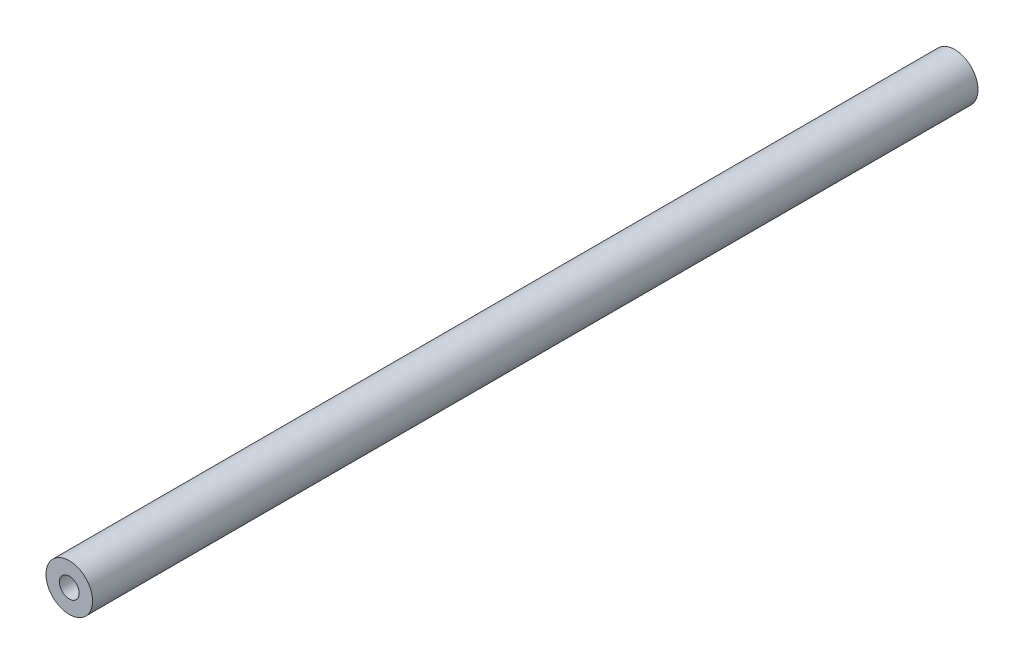
ISO-10303-21;
HEADER;
FILE_DESCRIPTION(('STEP AP214'),'2;1');
FILE_NAME('part.step','',(''),(''),'','','');
FILE_SCHEMA(('AUTOMOTIVE_DESIGN { 1 0 10303 214 1 1 1 1 }'));
ENDSEC;
DATA;
#1=APPLICATION_CONTEXT('core data for automotive mechanical design processes');
#2=APPLICATION_PROTOCOL_DEFINITION('international standard','automotive_design',2000,#1);
#3=PRODUCT_CONTEXT('',#1,'mechanical');
#4=PRODUCT('Part','Part','',(#3));
#5=PRODUCT_RELATED_PRODUCT_CATEGORY('part','',(#4));
#6=PRODUCT_DEFINITION_FORMATION('','',#4);
#7=PRODUCT_DEFINITION_CONTEXT('part definition',#1,'design');
#8=PRODUCT_DEFINITION('design','',#6,#7);
#9=PRODUCT_DEFINITION_SHAPE('','',#8);
#10=(LENGTH_UNIT() NAMED_UNIT(*) SI_UNIT(.MILLI.,.METRE.));
#11=(NAMED_UNIT(*) PLANE_ANGLE_UNIT() SI_UNIT($,.RADIAN.));
#12=(NAMED_UNIT(*) SI_UNIT($,.STERADIAN.) SOLID_ANGLE_UNIT());
#13=UNCERTAINTY_MEASURE_WITH_UNIT(LENGTH_MEASURE(1.E-05),#10,'distance_accuracy_value','');
#14=(GEOMETRIC_REPRESENTATION_CONTEXT(3) GLOBAL_UNCERTAINTY_ASSIGNED_CONTEXT((#13)) GLOBAL_UNIT_ASSIGNED_CONTEXT((#10,
#11,#12)) REPRESENTATION_CONTEXT('',''));
#15=CARTESIAN_POINT('',(0.,0.,0.));
#16=DIRECTION('',(0.,0.,1.));
#17=DIRECTION('',(1.,0.,0.));
#18=AXIS2_PLACEMENT_3D('',#15,#16,#17);
#19=CARTESIAN_POINT('',(0.,0.,90.4875));
#20=DIRECTION('',(0.,0.,-1.));
#21=DIRECTION('',(-1.,0.,0.));
#22=AXIS2_PLACEMENT_3D('',#19,#20,#21);
#23=CYLINDRICAL_SURFACE('',#22,4.7625);
#24=CARTESIAN_POINT('',(0.,0.,90.4875));
#25=DIRECTION('',(0.,0.,1.));
#26=DIRECTION('',(1.,0.,0.));
#27=AXIS2_PLACEMENT_3D('',#24,#25,#26);
#28=CIRCLE('',#27,4.7625);
#29=CARTESIAN_POINT('',(4.7625,0.,90.4875));
#30=VERTEX_POINT('',#29);
#31=EDGE_CURVE('E11',#30,#30,#28,.T.);
#32=ORIENTED_EDGE('',*,*,#31,.F.);
#33=EDGE_LOOP('',(#32));
#34=FACE_BOUND('',#33,.T.);
#35=CARTESIAN_POINT('',(0.,0.,-90.4875));
#36=DIRECTION('',(0.,0.,1.));
#37=DIRECTION('',(1.,0.,0.));
#38=AXIS2_PLACEMENT_3D('',#35,#36,#37);
#39=CIRCLE('',#38,4.7625);
#40=CARTESIAN_POINT('',(4.7625,0.,-90.4875));
#41=VERTEX_POINT('',#40);
#42=EDGE_CURVE('E44',#41,#41,#39,.T.);
#43=ORIENTED_EDGE('',*,*,#42,.T.);
#44=EDGE_LOOP('',(#43));
#45=FACE_BOUND('',#44,.T.);
#46=ADVANCED_FACE('F41',(#34,#45),#23,.T.);
#47=CARTESIAN_POINT('',(0.,0.,90.4875));
#48=DIRECTION('',(0.,0.,1.));
#49=DIRECTION('',(1.,0.,0.));
#50=AXIS2_PLACEMENT_3D('',#47,#48,#49);
#51=PLANE('',#50);
#52=CARTESIAN_POINT('',(0.,0.,90.4875));
#53=DIRECTION('',(0.,0.,1.));
#54=DIRECTION('',(1.,0.,0.));
#55=AXIS2_PLACEMENT_3D('',#52,#53,#54);
#56=CIRCLE('',#55,2.01929999999999);
#57=CARTESIAN_POINT('',(2.01929999999999,0.,90.4875));
#58=VERTEX_POINT('',#57);
#59=EDGE_CURVE('E65',#58,#58,#56,.T.);
#60=ORIENTED_EDGE('',*,*,#59,.F.);
#61=EDGE_LOOP('',(#60));
#62=FACE_BOUND('',#61,.T.);
#63=ORIENTED_EDGE('',*,*,#31,.T.);
#64=EDGE_LOOP('',(#63));
#65=FACE_BOUND('',#64,.T.);
#66=ADVANCED_FACE('F83',(#62,#65),#51,.T.);
#67=CARTESIAN_POINT('',(0.,0.,-90.4875));
#68=DIRECTION('',(0.,0.,1.));
#69=DIRECTION('',(1.,0.,0.));
#70=AXIS2_PLACEMENT_3D('',#67,#68,#69);
#71=PLANE('',#70);
#72=CARTESIAN_POINT('',(0.,0.,-90.4875));
#73=DIRECTION('',(0.,0.,-1.));
#74=DIRECTION('',(-1.,0.,0.));
#75=AXIS2_PLACEMENT_3D('',#72,#73,#74);
#76=CIRCLE('',#75,2.01929999999999);
#77=CARTESIAN_POINT('',(-2.01929999999999,0.,-90.4875));
#78=VERTEX_POINT('',#77);
#79=EDGE_CURVE('E64',#78,#78,#76,.T.);
#80=ORIENTED_EDGE('',*,*,#79,.F.);
#81=EDGE_LOOP('',(#80));
#82=FACE_BOUND('',#81,.T.);
#83=ORIENTED_EDGE('',*,*,#42,.F.);
#84=EDGE_LOOP('',(#83));
#85=FACE_BOUND('',#84,.T.);
#86=ADVANCED_FACE('F80',(#82,#85),#71,.F.);
#87=CARTESIAN_POINT('',(0.,0.,-78.5495));
#88=DIRECTION('',(0.,0.,-1.));
#89=DIRECTION('',(-1.,0.,0.));
#90=AXIS2_PLACEMENT_3D('',#87,#88,#89);
#91=CONICAL_SURFACE('',#90,2.01929999999999,1.02974425867665);
#92=CARTESIAN_POINT('',(0.,0.,-77.3361821519976));
#93=VERTEX_POINT('',#92);
#94=VERTEX_LOOP('',#93);
#95=FACE_BOUND('',#94,.T.);
#96=CARTESIAN_POINT('',(0.,0.,-78.5495));
#97=DIRECTION('',(0.,0.,-1.));
#98=DIRECTION('',(-1.,0.,0.));
#99=AXIS2_PLACEMENT_3D('',#96,#97,#98);
#100=CIRCLE('',#99,2.01929999999999);
#101=CARTESIAN_POINT('',(-2.01929999999999,0.,-78.5495));
#102=VERTEX_POINT('',#101);
#103=EDGE_CURVE('E68',#102,#102,#100,.T.);
#104=ORIENTED_EDGE('',*,*,#103,.T.);
#105=EDGE_LOOP('',(#104));
#106=FACE_BOUND('',#105,.T.);
#107=ADVANCED_FACE('F82',(#95,#106),#91,.F.);
#108=CARTESIAN_POINT('',(0.,0.,-90.4875));
#109=DIRECTION('',(0.,0.,-1.));
#110=DIRECTION('',(-1.,0.,0.));
#111=AXIS2_PLACEMENT_3D('',#108,#109,#110);
#112=CYLINDRICAL_SURFACE('',#111,2.01929999999999);
#113=ORIENTED_EDGE('',*,*,#103,.F.);
#114=EDGE_LOOP('',(#113));
#115=FACE_BOUND('',#114,.T.);
#116=ORIENTED_EDGE('',*,*,#79,.T.);
#117=EDGE_LOOP('',(#116));
#118=FACE_BOUND('',#117,.T.);
#119=ADVANCED_FACE('F58',(#115,#118),#112,.F.);
#120=CARTESIAN_POINT('',(0.,0.,78.5495));
#121=DIRECTION('',(0.,0.,1.));
#122=DIRECTION('',(1.,0.,0.));
#123=AXIS2_PLACEMENT_3D('',#120,#121,#122);
#124=CONICAL_SURFACE('',#123,2.01929999999999,1.02974425867665);
#125=CARTESIAN_POINT('',(0.,0.,77.3361821519976));
#126=VERTEX_POINT('',#125);
#127=VERTEX_LOOP('',#126);
#128=FACE_BOUND('',#127,.T.);
#129=CARTESIAN_POINT('',(0.,0.,78.5495));
#130=DIRECTION('',(0.,0.,1.));
#131=DIRECTION('',(1.,0.,0.));
#132=AXIS2_PLACEMENT_3D('',#129,#130,#131);
#133=CIRCLE('',#132,2.01929999999999);
#134=CARTESIAN_POINT('',(2.01929999999999,0.,78.5495));
#135=VERTEX_POINT('',#134);
#136=EDGE_CURVE('E62',#135,#135,#133,.T.);
#137=ORIENTED_EDGE('',*,*,#136,.T.);
#138=EDGE_LOOP('',(#137));
#139=FACE_BOUND('',#138,.T.);
#140=ADVANCED_FACE('F54',(#128,#139),#124,.F.);
#141=CARTESIAN_POINT('',(0.,0.,90.4875));
#142=DIRECTION('',(0.,0.,1.));
#143=DIRECTION('',(1.,0.,0.));
#144=AXIS2_PLACEMENT_3D('',#141,#142,#143);
#145=CYLINDRICAL_SURFACE('',#144,2.01929999999999);
#146=ORIENTED_EDGE('',*,*,#136,.F.);
#147=EDGE_LOOP('',(#146));
#148=FACE_BOUND('',#147,.T.);
#149=ORIENTED_EDGE('',*,*,#59,.T.);
#150=EDGE_LOOP('',(#149));
#151=FACE_BOUND('',#150,.T.);
#152=ADVANCED_FACE('F57',(#148,#151),#145,.F.);
#153=CLOSED_SHELL('',(#46,#66,#86,#107,#119,#140,#152));
#154=MANIFOLD_SOLID_BREP('B2',#153);
#155=ADVANCED_BREP_SHAPE_REPRESENTATION('',(#18,#154),#14);
#156=SHAPE_DEFINITION_REPRESENTATION(#9,#155);
ENDSEC;
END-ISO-10303-21;
